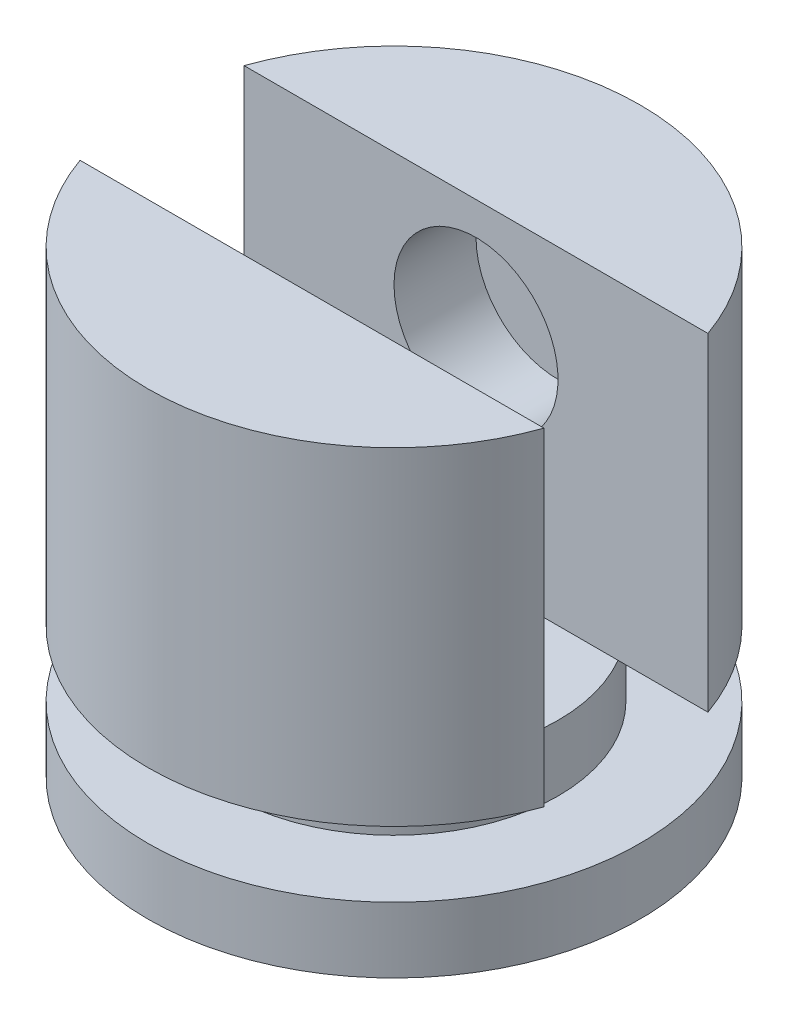
ISO-10303-21;
HEADER;
FILE_DESCRIPTION(('STEP AP214'),'2;1');
FILE_NAME('part.step','',(''),(''),'','','');
FILE_SCHEMA(('AUTOMOTIVE_DESIGN { 1 0 10303 214 1 1 1 1 }'));
ENDSEC;
DATA;
#1=APPLICATION_CONTEXT('core data for automotive mechanical design processes');
#2=APPLICATION_PROTOCOL_DEFINITION('international standard','automotive_design',2000,#1);
#3=PRODUCT_CONTEXT('',#1,'mechanical');
#4=PRODUCT('Part','Part','',(#3));
#5=PRODUCT_RELATED_PRODUCT_CATEGORY('part','',(#4));
#6=PRODUCT_DEFINITION_FORMATION('','',#4);
#7=PRODUCT_DEFINITION_CONTEXT('part definition',#1,'design');
#8=PRODUCT_DEFINITION('design','',#6,#7);
#9=PRODUCT_DEFINITION_SHAPE('','',#8);
#10=(LENGTH_UNIT() NAMED_UNIT(*) SI_UNIT(.MILLI.,.METRE.));
#11=(NAMED_UNIT(*) PLANE_ANGLE_UNIT() SI_UNIT($,.RADIAN.));
#12=(NAMED_UNIT(*) SI_UNIT($,.STERADIAN.) SOLID_ANGLE_UNIT());
#13=UNCERTAINTY_MEASURE_WITH_UNIT(LENGTH_MEASURE(1.E-05),#10,'distance_accuracy_value','');
#14=(GEOMETRIC_REPRESENTATION_CONTEXT(3) GLOBAL_UNCERTAINTY_ASSIGNED_CONTEXT((#13)) GLOBAL_UNIT_ASSIGNED_CONTEXT((#10,
#11,#12)) REPRESENTATION_CONTEXT('',''));
#15=CARTESIAN_POINT('',(0.,0.,0.));
#16=DIRECTION('',(0.,0.,1.));
#17=DIRECTION('',(1.,0.,0.));
#18=AXIS2_PLACEMENT_3D('',#15,#16,#17);
#19=CARTESIAN_POINT('',(15.,20.,-5.));
#20=DIRECTION('',(0.,0.,-1.));
#21=DIRECTION('',(-1.,0.,0.));
#22=AXIS2_PLACEMENT_3D('',#19,#20,#21);
#23=PLANE('',#22);
#24=DIRECTION('',(1.,0.,0.));
#25=VECTOR('',#24,1.);
#26=CARTESIAN_POINT('',(15.,20.,-5.));
#27=LINE('',#26,#25);
#28=CARTESIAN_POINT('',(-14.142135623731,20.,-5.));
#29=VERTEX_POINT('',#28);
#30=CARTESIAN_POINT('',(14.142135623731,20.,-5.));
#31=VERTEX_POINT('',#30);
#32=EDGE_CURVE('E93',#29,#31,#27,.T.);
#33=ORIENTED_EDGE('',*,*,#32,.F.);
#34=DIRECTION('',(0.,-1.,0.));
#35=VECTOR('',#34,1.);
#36=CARTESIAN_POINT('',(-14.142135623731,20.,-5.));
#37=LINE('',#36,#35);
#38=CARTESIAN_POINT('',(-14.142135623731,0.,-5.));
#39=VERTEX_POINT('',#38);
#40=EDGE_CURVE('E86',#39,#29,#37,.F.);
#41=ORIENTED_EDGE('',*,*,#40,.F.);
#42=DIRECTION('',(1.,0.,0.));
#43=VECTOR('',#42,1.);
#44=CARTESIAN_POINT('',(15.,0.,-5.));
#45=LINE('',#44,#43);
#46=CARTESIAN_POINT('',(-8.66025403784439,0.,-5.));
#47=VERTEX_POINT('',#46);
#48=EDGE_CURVE('E90',#39,#47,#45,.T.);
#49=ORIENTED_EDGE('',*,*,#48,.T.);
#50=CARTESIAN_POINT('',(8.66025403784439,0.,-5.));
#51=VERTEX_POINT('',#50);
#52=EDGE_CURVE('E107',#47,#51,#45,.T.);
#53=ORIENTED_EDGE('',*,*,#52,.T.);
#54=CARTESIAN_POINT('',(14.142135623731,0.,-5.));
#55=VERTEX_POINT('',#54);
#56=EDGE_CURVE('E109',#51,#55,#45,.T.);
#57=ORIENTED_EDGE('',*,*,#56,.T.);
#58=DIRECTION('',(0.,-1.,0.));
#59=VECTOR('',#58,1.);
#60=CARTESIAN_POINT('',(14.142135623731,20.,-5.));
#61=LINE('',#60,#59);
#62=EDGE_CURVE('E98',#31,#55,#61,.T.);
#63=ORIENTED_EDGE('',*,*,#62,.F.);
#64=EDGE_LOOP('',(#33,#41,#49,#53,#57,#63));
#65=FACE_BOUND('',#64,.T.);
#66=CARTESIAN_POINT('',(0.,13.,-5.));
#67=DIRECTION('',(0.,0.,-1.));
#68=DIRECTION('',(-1.,0.,0.));
#69=AXIS2_PLACEMENT_3D('',#66,#67,#68);
#70=CIRCLE('',#69,5.);
#71=CARTESIAN_POINT('',(-5.,13.,-5.));
#72=VERTEX_POINT('',#71);
#73=EDGE_CURVE('E327',#72,#72,#70,.T.);
#74=ORIENTED_EDGE('',*,*,#73,.T.);
#75=EDGE_LOOP('',(#74));
#76=FACE_BOUND('',#75,.T.);
#77=ADVANCED_FACE('F35',(#65,#76),#23,.F.);
#78=CARTESIAN_POINT('',(0.,20.,0.));
#79=DIRECTION('',(0.,-1.,0.));
#80=DIRECTION('',(0.,0.,-1.));
#81=AXIS2_PLACEMENT_3D('',#78,#79,#80);
#82=CYLINDRICAL_SURFACE('',#81,15.);
#83=CARTESIAN_POINT('',(0.,20.,0.));
#84=DIRECTION('',(0.,1.,0.));
#85=DIRECTION('',(0.,0.,1.));
#86=AXIS2_PLACEMENT_3D('',#83,#84,#85);
#87=CIRCLE('',#86,15.);
#88=EDGE_CURVE('E116',#31,#29,#87,.T.);
#89=ORIENTED_EDGE('',*,*,#88,.F.);
#90=ORIENTED_EDGE('',*,*,#62,.T.);
#91=CARTESIAN_POINT('',(0.,0.,0.));
#92=DIRECTION('',(0.,1.,0.));
#93=DIRECTION('',(0.,0.,1.));
#94=AXIS2_PLACEMENT_3D('',#91,#92,#93);
#95=CIRCLE('',#94,15.);
#96=EDGE_CURVE('E104',#55,#39,#95,.T.);
#97=ORIENTED_EDGE('',*,*,#96,.T.);
#98=ORIENTED_EDGE('',*,*,#40,.T.);
#99=EDGE_LOOP('',(#89,#90,#97,#98));
#100=FACE_BOUND('',#99,.T.);
#101=ADVANCED_FACE('F111',(#100),#82,.T.);
#102=DIRECTION('',(0.,-1.,0.));
#103=VECTOR('',#102,1.);
#104=CARTESIAN_POINT('',(14.142135623731,20.,5.));
#105=LINE('',#104,#103);
#106=CARTESIAN_POINT('',(14.142135623731,20.,5.));
#107=VERTEX_POINT('',#106);
#108=CARTESIAN_POINT('',(14.142135623731,0.,5.));
#109=VERTEX_POINT('',#108);
#110=EDGE_CURVE('E119',#107,#109,#105,.T.);
#111=ORIENTED_EDGE('',*,*,#110,.F.);
#112=CARTESIAN_POINT('',(-14.142135623731,20.,5.));
#113=VERTEX_POINT('',#112);
#114=EDGE_CURVE('E112',#113,#107,#87,.T.);
#115=ORIENTED_EDGE('',*,*,#114,.F.);
#116=DIRECTION('',(0.,-1.,0.));
#117=VECTOR('',#116,1.);
#118=CARTESIAN_POINT('',(-14.142135623731,20.,5.));
#119=LINE('',#118,#117);
#120=CARTESIAN_POINT('',(-14.142135623731,0.,5.));
#121=VERTEX_POINT('',#120);
#122=EDGE_CURVE('E157',#121,#113,#119,.F.);
#123=ORIENTED_EDGE('',*,*,#122,.F.);
#124=EDGE_CURVE('E113',#121,#109,#95,.T.);
#125=ORIENTED_EDGE('',*,*,#124,.T.);
#126=EDGE_LOOP('',(#111,#115,#123,#125));
#127=FACE_BOUND('',#126,.T.);
#128=ADVANCED_FACE('F162',(#127),#82,.T.);
#129=CARTESIAN_POINT('',(0.,20.,0.));
#130=DIRECTION('',(0.,1.,0.));
#131=DIRECTION('',(0.,0.,1.));
#132=AXIS2_PLACEMENT_3D('',#129,#130,#131);
#133=PLANE('',#132);
#134=ORIENTED_EDGE('',*,*,#32,.T.);
#135=ORIENTED_EDGE('',*,*,#88,.T.);
#136=EDGE_LOOP('',(#134,#135));
#137=FACE_BOUND('',#136,.T.);
#138=ADVANCED_FACE('F167',(#137),#133,.T.);
#139=ORIENTED_EDGE('',*,*,#114,.T.);
#140=DIRECTION('',(1.,0.,0.));
#141=VECTOR('',#140,1.);
#142=CARTESIAN_POINT('',(15.,20.,5.));
#143=LINE('',#142,#141);
#144=EDGE_CURVE('E56',#113,#107,#143,.T.);
#145=ORIENTED_EDGE('',*,*,#144,.F.);
#146=EDGE_LOOP('',(#139,#145));
#147=FACE_BOUND('',#146,.T.);
#148=ADVANCED_FACE('F165',(#147),#133,.T.);
#149=CARTESIAN_POINT('',(0.,0.,0.));
#150=DIRECTION('',(0.,1.,0.));
#151=DIRECTION('',(0.,0.,1.));
#152=AXIS2_PLACEMENT_3D('',#149,#150,#151);
#153=PLANE('',#152);
#154=ORIENTED_EDGE('',*,*,#96,.F.);
#155=ORIENTED_EDGE('',*,*,#56,.F.);
#156=CARTESIAN_POINT('',(0.,0.,0.));
#157=DIRECTION('',(0.,1.,0.));
#158=DIRECTION('',(0.,0.,1.));
#159=AXIS2_PLACEMENT_3D('',#156,#157,#158);
#160=CIRCLE('',#159,10.);
#161=EDGE_CURVE('E106',#51,#47,#160,.T.);
#162=ORIENTED_EDGE('',*,*,#161,.T.);
#163=ORIENTED_EDGE('',*,*,#48,.F.);
#164=EDGE_LOOP('',(#154,#155,#162,#163));
#165=FACE_BOUND('',#164,.T.);
#166=ADVANCED_FACE('F102',(#165),#153,.F.);
#167=DIRECTION('',(-1.,0.,0.));
#168=VECTOR('',#167,1.);
#169=CARTESIAN_POINT('',(0.,0.,5.));
#170=LINE('',#169,#168);
#171=CARTESIAN_POINT('',(8.66025403784439,0.,5.));
#172=VERTEX_POINT('',#171);
#173=EDGE_CURVE('E11',#109,#172,#170,.T.);
#174=ORIENTED_EDGE('',*,*,#173,.F.);
#175=ORIENTED_EDGE('',*,*,#124,.F.);
#176=CARTESIAN_POINT('',(-8.66025403784439,0.,5.));
#177=VERTEX_POINT('',#176);
#178=EDGE_CURVE('E39',#177,#121,#170,.T.);
#179=ORIENTED_EDGE('',*,*,#178,.F.);
#180=EDGE_CURVE('E130',#177,#172,#160,.T.);
#181=ORIENTED_EDGE('',*,*,#180,.T.);
#182=EDGE_LOOP('',(#174,#175,#179,#181));
#183=FACE_BOUND('',#182,.T.);
#184=ADVANCED_FACE('F141',(#183),#153,.F.);
#185=CARTESIAN_POINT('',(0.,-4.,0.));
#186=DIRECTION('',(0.,1.,0.));
#187=DIRECTION('',(0.,0.,1.));
#188=AXIS2_PLACEMENT_3D('',#185,#186,#187);
#189=CYLINDRICAL_SURFACE('',#188,10.);
#190=CARTESIAN_POINT('',(0.,-4.,0.));
#191=DIRECTION('',(0.,-1.,0.));
#192=DIRECTION('',(0.,0.,-1.));
#193=AXIS2_PLACEMENT_3D('',#190,#191,#192);
#194=CIRCLE('',#193,10.);
#195=CARTESIAN_POINT('',(0.,-4.,-10.));
#196=VERTEX_POINT('',#195);
#197=EDGE_CURVE('E125',#196,#196,#194,.F.);
#198=ORIENTED_EDGE('',*,*,#197,.T.);
#199=EDGE_LOOP('',(#198));
#200=FACE_BOUND('',#199,.T.);
#201=EDGE_CURVE('E131',#172,#51,#160,.T.);
#202=ORIENTED_EDGE('',*,*,#201,.F.);
#203=ORIENTED_EDGE('',*,*,#180,.F.);
#204=EDGE_CURVE('E132',#47,#177,#160,.T.);
#205=ORIENTED_EDGE('',*,*,#204,.F.);
#206=ORIENTED_EDGE('',*,*,#161,.F.);
#207=EDGE_LOOP('',(#202,#203,#205,#206));
#208=FACE_BOUND('',#207,.T.);
#209=ADVANCED_FACE('F37',(#200,#208),#189,.T.);
#210=CARTESIAN_POINT('',(0.,-8.,0.));
#211=DIRECTION('',(0.,1.,0.));
#212=DIRECTION('',(0.,0.,1.));
#213=AXIS2_PLACEMENT_3D('',#210,#211,#212);
#214=CYLINDRICAL_SURFACE('',#213,15.);
#215=CARTESIAN_POINT('',(0.,-8.,0.));
#216=DIRECTION('',(0.,-1.,0.));
#217=DIRECTION('',(0.,0.,-1.));
#218=AXIS2_PLACEMENT_3D('',#215,#216,#217);
#219=CIRCLE('',#218,15.);
#220=CARTESIAN_POINT('',(0.,-8.,-15.));
#221=VERTEX_POINT('',#220);
#222=EDGE_CURVE('E122',#221,#221,#219,.T.);
#223=ORIENTED_EDGE('',*,*,#222,.F.);
#224=EDGE_LOOP('',(#223));
#225=FACE_BOUND('',#224,.T.);
#226=CARTESIAN_POINT('',(0.,-4.,0.));
#227=DIRECTION('',(0.,-1.,0.));
#228=DIRECTION('',(0.,0.,-1.));
#229=AXIS2_PLACEMENT_3D('',#226,#227,#228);
#230=CIRCLE('',#229,15.);
#231=CARTESIAN_POINT('',(0.,-4.,-15.));
#232=VERTEX_POINT('',#231);
#233=EDGE_CURVE('E126',#232,#232,#230,.T.);
#234=ORIENTED_EDGE('',*,*,#233,.T.);
#235=EDGE_LOOP('',(#234));
#236=FACE_BOUND('',#235,.T.);
#237=ADVANCED_FACE('F257',(#225,#236),#214,.T.);
#238=CARTESIAN_POINT('',(0.,-8.,0.));
#239=DIRECTION('',(0.,-1.,0.));
#240=DIRECTION('',(0.,0.,-1.));
#241=AXIS2_PLACEMENT_3D('',#238,#239,#240);
#242=PLANE('',#241);
#243=ORIENTED_EDGE('',*,*,#222,.T.);
#244=EDGE_LOOP('',(#243));
#245=FACE_BOUND('',#244,.T.);
#246=ADVANCED_FACE('F303',(#245),#242,.T.);
#247=CARTESIAN_POINT('',(0.,-4.,0.));
#248=DIRECTION('',(0.,-1.,0.));
#249=DIRECTION('',(0.,0.,-1.));
#250=AXIS2_PLACEMENT_3D('',#247,#248,#249);
#251=PLANE('',#250);
#252=ORIENTED_EDGE('',*,*,#197,.F.);
#253=EDGE_LOOP('',(#252));
#254=FACE_BOUND('',#253,.T.);
#255=ORIENTED_EDGE('',*,*,#233,.F.);
#256=EDGE_LOOP('',(#255));
#257=FACE_BOUND('',#256,.T.);
#258=ADVANCED_FACE('F195',(#254,#257),#251,.F.);
#259=CARTESIAN_POINT('',(0.,0.,0.));
#260=DIRECTION('',(0.,-1.,0.));
#261=DIRECTION('',(0.,0.,-1.));
#262=AXIS2_PLACEMENT_3D('',#259,#260,#261);
#263=PLANE('',#262);
#264=ORIENTED_EDGE('',*,*,#204,.T.);
#265=DIRECTION('',(1.,0.,0.));
#266=VECTOR('',#265,1.);
#267=CARTESIAN_POINT('',(15.,0.,5.));
#268=LINE('',#267,#266);
#269=EDGE_CURVE('E49',#177,#172,#268,.T.);
#270=ORIENTED_EDGE('',*,*,#269,.T.);
#271=ORIENTED_EDGE('',*,*,#201,.T.);
#272=ORIENTED_EDGE('',*,*,#52,.F.);
#273=EDGE_LOOP('',(#264,#270,#271,#272));
#274=FACE_BOUND('',#273,.T.);
#275=ADVANCED_FACE('F144',(#274),#263,.F.);
#276=CARTESIAN_POINT('',(15.,20.,5.));
#277=DIRECTION('',(0.,0.,-1.));
#278=DIRECTION('',(-1.,0.,0.));
#279=AXIS2_PLACEMENT_3D('',#276,#277,#278);
#280=PLANE('',#279);
#281=CARTESIAN_POINT('',(0.,13.,5.));
#282=DIRECTION('',(0.,0.,-1.));
#283=DIRECTION('',(-1.,0.,0.));
#284=AXIS2_PLACEMENT_3D('',#281,#282,#283);
#285=CIRCLE('',#284,5.);
#286=CARTESIAN_POINT('',(-5.,13.,5.));
#287=VERTEX_POINT('',#286);
#288=EDGE_CURVE('E150',#287,#287,#285,.T.);
#289=ORIENTED_EDGE('',*,*,#288,.F.);
#290=EDGE_LOOP('',(#289));
#291=FACE_BOUND('',#290,.T.);
#292=ORIENTED_EDGE('',*,*,#110,.T.);
#293=ORIENTED_EDGE('',*,*,#173,.T.);
#294=ORIENTED_EDGE('',*,*,#269,.F.);
#295=ORIENTED_EDGE('',*,*,#178,.T.);
#296=ORIENTED_EDGE('',*,*,#122,.T.);
#297=ORIENTED_EDGE('',*,*,#144,.T.);
#298=EDGE_LOOP('',(#292,#293,#294,#295,#296,#297));
#299=FACE_BOUND('',#298,.T.);
#300=ADVANCED_FACE('F159',(#291,#299),#280,.T.);
#301=CARTESIAN_POINT('',(0.,13.,10.));
#302=DIRECTION('',(0.,0.,-1.));
#303=DIRECTION('',(-1.,0.,0.));
#304=AXIS2_PLACEMENT_3D('',#301,#302,#303);
#305=CYLINDRICAL_SURFACE('',#304,5.);
#306=CARTESIAN_POINT('',(0.,13.,10.));
#307=DIRECTION('',(0.,0.,-1.));
#308=DIRECTION('',(-1.,0.,0.));
#309=AXIS2_PLACEMENT_3D('',#306,#307,#308);
#310=CIRCLE('',#309,5.);
#311=CARTESIAN_POINT('',(-5.,13.,10.));
#312=VERTEX_POINT('',#311);
#313=EDGE_CURVE('E151',#312,#312,#310,.T.);
#314=ORIENTED_EDGE('',*,*,#313,.F.);
#315=EDGE_LOOP('',(#314));
#316=FACE_BOUND('',#315,.T.);
#317=ORIENTED_EDGE('',*,*,#288,.T.);
#318=EDGE_LOOP('',(#317));
#319=FACE_BOUND('',#318,.T.);
#320=ADVANCED_FACE('F189',(#316,#319),#305,.F.);
#321=CARTESIAN_POINT('',(0.,13.,10.));
#322=DIRECTION('',(0.,0.,-1.));
#323=DIRECTION('',(-1.,0.,0.));
#324=AXIS2_PLACEMENT_3D('',#321,#322,#323);
#325=PLANE('',#324);
#326=ORIENTED_EDGE('',*,*,#313,.T.);
#327=EDGE_LOOP('',(#326));
#328=FACE_BOUND('',#327,.T.);
#329=ADVANCED_FACE('F186',(#328),#325,.T.);
#330=CARTESIAN_POINT('',(0.,13.,-10.));
#331=DIRECTION('',(0.,0.,1.));
#332=DIRECTION('',(1.,0.,0.));
#333=AXIS2_PLACEMENT_3D('',#330,#331,#332);
#334=CYLINDRICAL_SURFACE('',#333,5.);
#335=CARTESIAN_POINT('',(0.,13.,-10.));
#336=DIRECTION('',(0.,0.,-1.));
#337=DIRECTION('',(-1.,0.,0.));
#338=AXIS2_PLACEMENT_3D('',#335,#336,#337);
#339=CIRCLE('',#338,5.);
#340=CARTESIAN_POINT('',(-5.,13.,-10.));
#341=VERTEX_POINT('',#340);
#342=EDGE_CURVE('E145',#341,#341,#339,.T.);
#343=ORIENTED_EDGE('',*,*,#342,.T.);
#344=EDGE_LOOP('',(#343));
#345=FACE_BOUND('',#344,.T.);
#346=ORIENTED_EDGE('',*,*,#73,.F.);
#347=EDGE_LOOP('',(#346));
#348=FACE_BOUND('',#347,.T.);
#349=ADVANCED_FACE('F184',(#345,#348),#334,.F.);
#350=CARTESIAN_POINT('',(0.,13.,-10.));
#351=DIRECTION('',(0.,0.,1.));
#352=DIRECTION('',(-1.,0.,0.));
#353=AXIS2_PLACEMENT_3D('',#350,#351,#352);
#354=PLANE('',#353);
#355=ORIENTED_EDGE('',*,*,#342,.F.);
#356=EDGE_LOOP('',(#355));
#357=FACE_BOUND('',#356,.T.);
#358=ADVANCED_FACE('F220',(#357),#354,.T.);
#359=CLOSED_SHELL('',(#77,#101,#128,#138,#148,#166,#184,#209,#237,#246,#258,#275,#300,#320,#329,
#349,#358));
#360=MANIFOLD_SOLID_BREP('B2',#359);
#361=ADVANCED_BREP_SHAPE_REPRESENTATION('',(#18,#360),#14);
#362=SHAPE_DEFINITION_REPRESENTATION(#9,#361);
ENDSEC;
END-ISO-10303-21;
